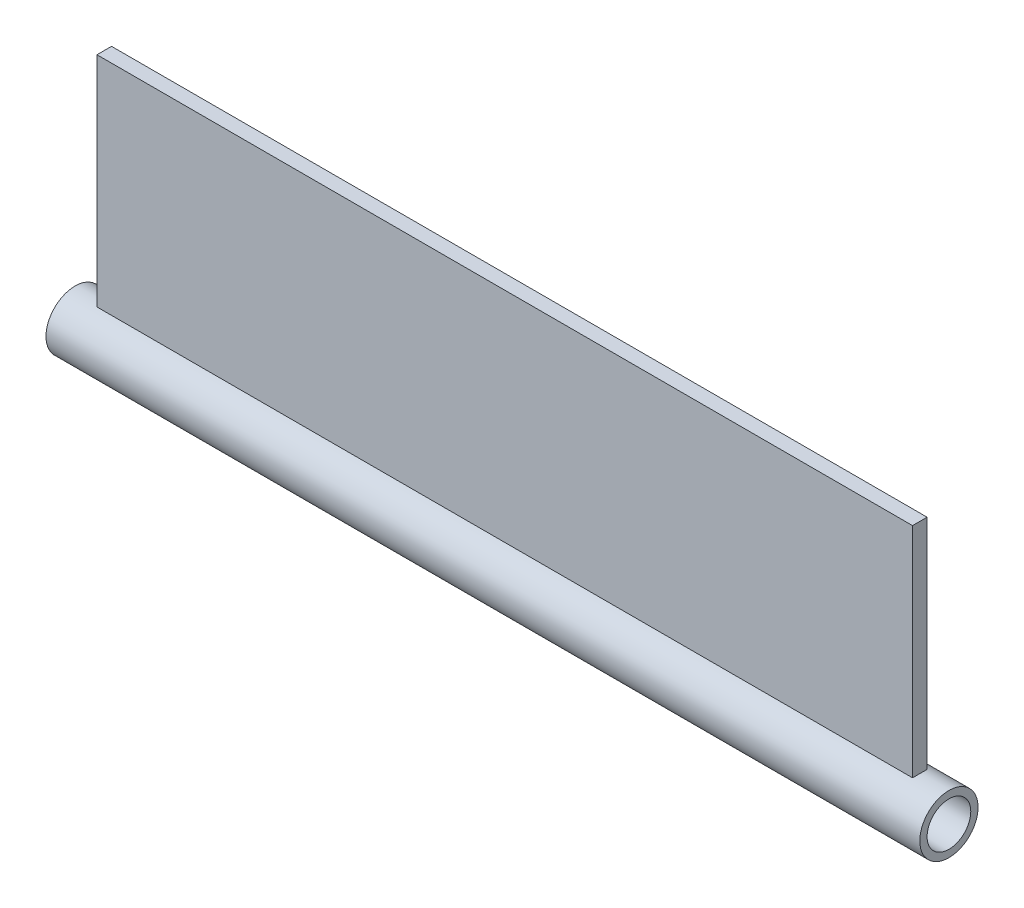
ISO-10303-21;
HEADER;
FILE_DESCRIPTION(('STEP AP214'),'2;1');
FILE_NAME('part.step','',(''),(''),'','','');
FILE_SCHEMA(('AUTOMOTIVE_DESIGN { 1 0 10303 214 1 1 1 1 }'));
ENDSEC;
DATA;
#1=APPLICATION_CONTEXT('core data for automotive mechanical design processes');
#2=APPLICATION_PROTOCOL_DEFINITION('international standard','automotive_design',2000,#1);
#3=PRODUCT_CONTEXT('',#1,'mechanical');
#4=PRODUCT('Part','Part','',(#3));
#5=PRODUCT_RELATED_PRODUCT_CATEGORY('part','',(#4));
#6=PRODUCT_DEFINITION_FORMATION('','',#4);
#7=PRODUCT_DEFINITION_CONTEXT('part definition',#1,'design');
#8=PRODUCT_DEFINITION('design','',#6,#7);
#9=PRODUCT_DEFINITION_SHAPE('','',#8);
#10=(LENGTH_UNIT() NAMED_UNIT(*) SI_UNIT(.MILLI.,.METRE.));
#11=(NAMED_UNIT(*) PLANE_ANGLE_UNIT() SI_UNIT($,.RADIAN.));
#12=(NAMED_UNIT(*) SI_UNIT($,.STERADIAN.) SOLID_ANGLE_UNIT());
#13=UNCERTAINTY_MEASURE_WITH_UNIT(LENGTH_MEASURE(1.E-05),#10,'distance_accuracy_value','');
#14=(GEOMETRIC_REPRESENTATION_CONTEXT(3) GLOBAL_UNCERTAINTY_ASSIGNED_CONTEXT((#13)) GLOBAL_UNIT_ASSIGNED_CONTEXT((#10,
#11,#12)) REPRESENTATION_CONTEXT('',''));
#15=CARTESIAN_POINT('',(0.,0.,0.));
#16=DIRECTION('',(0.,0.,1.));
#17=DIRECTION('',(1.,0.,0.));
#18=AXIS2_PLACEMENT_3D('',#15,#16,#17);
#19=CARTESIAN_POINT('',(147.32,43.18,-1.27));
#20=DIRECTION('',(1.,0.,0.));
#21=DIRECTION('',(0.,0.,-1.));
#22=AXIS2_PLACEMENT_3D('',#19,#20,#21);
#23=PLANE('',#22);
#24=DIRECTION('',(0.,0.,1.));
#25=VECTOR('',#24,1.);
#26=CARTESIAN_POINT('',(147.32,43.18,-1.27));
#27=LINE('',#26,#25);
#28=CARTESIAN_POINT('',(147.32,43.18,-1.27));
#29=VERTEX_POINT('',#28);
#30=CARTESIAN_POINT('',(147.32,43.18,1.27));
#31=VERTEX_POINT('',#30);
#32=EDGE_CURVE('E48',#29,#31,#27,.T.);
#33=ORIENTED_EDGE('',*,*,#32,.T.);
#34=DIRECTION('',(0.,1.,0.));
#35=VECTOR('',#34,1.);
#36=CARTESIAN_POINT('',(147.32,43.18,1.27));
#37=LINE('',#36,#35);
#38=CARTESIAN_POINT('',(147.32,5.08,1.27));
#39=VERTEX_POINT('',#38);
#40=EDGE_CURVE('E85',#39,#31,#37,.T.);
#41=ORIENTED_EDGE('',*,*,#40,.F.);
#42=DIRECTION('',(0.,0.,1.));
#43=VECTOR('',#42,1.);
#44=CARTESIAN_POINT('',(147.32,5.08,-1.27));
#45=LINE('',#44,#43);
#46=CARTESIAN_POINT('',(147.32,5.08,-1.27));
#47=VERTEX_POINT('',#46);
#48=EDGE_CURVE('E12',#47,#39,#45,.T.);
#49=ORIENTED_EDGE('',*,*,#48,.F.);
#50=DIRECTION('',(0.,1.,0.));
#51=VECTOR('',#50,1.);
#52=CARTESIAN_POINT('',(147.32,43.18,-1.27));
#53=LINE('',#52,#51);
#54=EDGE_CURVE('E86',#47,#29,#53,.T.);
#55=ORIENTED_EDGE('',*,*,#54,.T.);
#56=EDGE_LOOP('',(#33,#41,#49,#55));
#57=FACE_BOUND('',#56,.T.);
#58=ADVANCED_FACE('F45',(#57),#23,.T.);
#59=CARTESIAN_POINT('',(147.32,5.08,-1.27));
#60=DIRECTION('',(0.,-1.,0.));
#61=DIRECTION('',(1.,0.,0.));
#62=AXIS2_PLACEMENT_3D('',#59,#60,#61);
#63=PLANE('',#62);
#64=ORIENTED_EDGE('',*,*,#48,.T.);
#65=DIRECTION('',(1.,0.,0.));
#66=VECTOR('',#65,1.);
#67=CARTESIAN_POINT('',(147.32,5.08,1.27));
#68=LINE('',#67,#66);
#69=CARTESIAN_POINT('',(5.08000000000003,5.08,1.27));
#70=VERTEX_POINT('',#69);
#71=EDGE_CURVE('E102',#70,#39,#68,.T.);
#72=ORIENTED_EDGE('',*,*,#71,.F.);
#73=DIRECTION('',(0.,0.,1.));
#74=VECTOR('',#73,1.);
#75=CARTESIAN_POINT('',(5.08000000000003,5.08,-1.27));
#76=LINE('',#75,#74);
#77=CARTESIAN_POINT('',(5.08000000000003,5.08,-1.27));
#78=VERTEX_POINT('',#77);
#79=EDGE_CURVE('E53',#78,#70,#76,.T.);
#80=ORIENTED_EDGE('',*,*,#79,.F.);
#81=DIRECTION('',(1.,0.,0.));
#82=VECTOR('',#81,1.);
#83=CARTESIAN_POINT('',(147.32,5.08,-1.27));
#84=LINE('',#83,#82);
#85=EDGE_CURVE('E91',#78,#47,#84,.T.);
#86=ORIENTED_EDGE('',*,*,#85,.T.);
#87=EDGE_LOOP('',(#64,#72,#80,#86));
#88=FACE_BOUND('',#87,.T.);
#89=ADVANCED_FACE('F117',(#88),#63,.T.);
#90=CARTESIAN_POINT('',(5.08000000000003,43.18,-1.27));
#91=DIRECTION('',(-1.,0.,0.));
#92=DIRECTION('',(0.,0.,1.));
#93=AXIS2_PLACEMENT_3D('',#90,#91,#92);
#94=PLANE('',#93);
#95=ORIENTED_EDGE('',*,*,#79,.T.);
#96=DIRECTION('',(0.,-1.,0.));
#97=VECTOR('',#96,1.);
#98=CARTESIAN_POINT('',(5.08000000000003,43.18,1.27));
#99=LINE('',#98,#97);
#100=CARTESIAN_POINT('',(5.08000000000003,43.18,1.27));
#101=VERTEX_POINT('',#100);
#102=EDGE_CURVE('E98',#101,#70,#99,.T.);
#103=ORIENTED_EDGE('',*,*,#102,.F.);
#104=DIRECTION('',(0.,0.,1.));
#105=VECTOR('',#104,1.);
#106=CARTESIAN_POINT('',(5.08000000000003,43.18,-1.27));
#107=LINE('',#106,#105);
#108=CARTESIAN_POINT('',(5.08000000000003,43.18,-1.27));
#109=VERTEX_POINT('',#108);
#110=EDGE_CURVE('E90',#109,#101,#107,.T.);
#111=ORIENTED_EDGE('',*,*,#110,.F.);
#112=DIRECTION('',(0.,-1.,0.));
#113=VECTOR('',#112,1.);
#114=CARTESIAN_POINT('',(5.08000000000003,43.18,-1.27));
#115=LINE('',#114,#113);
#116=EDGE_CURVE('E110',#109,#78,#115,.T.);
#117=ORIENTED_EDGE('',*,*,#116,.T.);
#118=EDGE_LOOP('',(#95,#103,#111,#117));
#119=FACE_BOUND('',#118,.T.);
#120=ADVANCED_FACE('F114',(#119),#94,.T.);
#121=CARTESIAN_POINT('',(147.32,43.18,-1.27));
#122=DIRECTION('',(0.,1.,0.));
#123=DIRECTION('',(-1.,0.,0.));
#124=AXIS2_PLACEMENT_3D('',#121,#122,#123);
#125=PLANE('',#124);
#126=ORIENTED_EDGE('',*,*,#110,.T.);
#127=DIRECTION('',(-1.,0.,0.));
#128=VECTOR('',#127,1.);
#129=CARTESIAN_POINT('',(147.32,43.18,1.27));
#130=LINE('',#129,#128);
#131=EDGE_CURVE('E93',#31,#101,#130,.T.);
#132=ORIENTED_EDGE('',*,*,#131,.F.);
#133=ORIENTED_EDGE('',*,*,#32,.F.);
#134=DIRECTION('',(-1.,0.,0.));
#135=VECTOR('',#134,1.);
#136=CARTESIAN_POINT('',(147.32,43.18,-1.27));
#137=LINE('',#136,#135);
#138=EDGE_CURVE('E108',#29,#109,#137,.T.);
#139=ORIENTED_EDGE('',*,*,#138,.T.);
#140=EDGE_LOOP('',(#126,#132,#133,#139));
#141=FACE_BOUND('',#140,.T.);
#142=ADVANCED_FACE('F94',(#141),#125,.T.);
#143=CARTESIAN_POINT('',(0.,0.,-1.27));
#144=DIRECTION('',(0.,0.,-1.));
#145=DIRECTION('',(-1.,0.,0.));
#146=AXIS2_PLACEMENT_3D('',#143,#144,#145);
#147=PLANE('',#146);
#148=ORIENTED_EDGE('',*,*,#54,.F.);
#149=ORIENTED_EDGE('',*,*,#85,.F.);
#150=ORIENTED_EDGE('',*,*,#116,.F.);
#151=ORIENTED_EDGE('',*,*,#138,.F.);
#152=EDGE_LOOP('',(#148,#149,#150,#151));
#153=FACE_BOUND('',#152,.T.);
#154=ADVANCED_FACE('F119',(#153),#147,.T.);
#155=CARTESIAN_POINT('',(0.,0.,1.27));
#156=DIRECTION('',(0.,0.,-1.));
#157=DIRECTION('',(-1.,0.,0.));
#158=AXIS2_PLACEMENT_3D('',#155,#156,#157);
#159=PLANE('',#158);
#160=ORIENTED_EDGE('',*,*,#40,.T.);
#161=ORIENTED_EDGE('',*,*,#131,.T.);
#162=ORIENTED_EDGE('',*,*,#102,.T.);
#163=ORIENTED_EDGE('',*,*,#71,.T.);
#164=EDGE_LOOP('',(#160,#161,#162,#163));
#165=FACE_BOUND('',#164,.T.);
#166=ADVANCED_FACE('F101',(#165),#159,.F.);
#167=CLOSED_SHELL('',(#58,#89,#120,#142,#154,#166));
#168=MANIFOLD_SOLID_BREP('B2',#167);
#169=CARTESIAN_POINT('',(152.4,0.,0.));
#170=DIRECTION('',(-1.,0.,0.));
#171=DIRECTION('',(0.,0.,1.));
#172=AXIS2_PLACEMENT_3D('',#169,#170,#171);
#173=CYLINDRICAL_SURFACE('',#172,5.08);
#174=CARTESIAN_POINT('',(152.4,0.,0.));
#175=DIRECTION('',(1.,0.,0.));
#176=DIRECTION('',(0.,0.,-1.));
#177=AXIS2_PLACEMENT_3D('',#174,#175,#176);
#178=CIRCLE('',#177,5.08);
#179=CARTESIAN_POINT('',(152.4,0.,5.08));
#180=VERTEX_POINT('',#179);
#181=EDGE_CURVE('E44',#180,#180,#178,.T.);
#182=CARTESIAN_POINT('',(0.,0.,0.));
#183=DIRECTION('',(1.,0.,0.));
#184=DIRECTION('',(0.,0.,-1.));
#185=AXIS2_PLACEMENT_3D('',#182,#183,#184);
#186=CIRCLE('',#185,5.08);
#187=CARTESIAN_POINT('',(0.,0.,5.08));
#188=VERTEX_POINT('',#187);
#189=EDGE_CURVE('E178',#188,#188,#186,.T.);
#190=CARTESIAN_POINT('',(152.4,0.,5.08));
#191=CARTESIAN_POINT('',(150.8125,0.,5.08));
#192=CARTESIAN_POINT('',(149.225,0.,5.08));
#193=CARTESIAN_POINT('',(146.05,0.,5.08));
#194=CARTESIAN_POINT('',(144.4625,0.,5.08));
#195=CARTESIAN_POINT('',(141.2875,0.,5.08));
#196=CARTESIAN_POINT('',(139.7,0.,5.08));
#197=CARTESIAN_POINT('',(136.525,0.,5.08));
#198=CARTESIAN_POINT('',(134.9375,0.,5.08));
#199=CARTESIAN_POINT('',(131.7625,0.,5.08));
#200=CARTESIAN_POINT('',(130.175,0.,5.08));
#201=CARTESIAN_POINT('',(127.,0.,5.08));
#202=CARTESIAN_POINT('',(125.4125,0.,5.08));
#203=CARTESIAN_POINT('',(122.2375,0.,5.08));
#204=CARTESIAN_POINT('',(120.65,0.,5.08));
#205=CARTESIAN_POINT('',(117.475,0.,5.08));
#206=CARTESIAN_POINT('',(115.8875,0.,5.08));
#207=CARTESIAN_POINT('',(112.7125,0.,5.08));
#208=CARTESIAN_POINT('',(111.125,0.,5.08));
#209=CARTESIAN_POINT('',(107.95,0.,5.08));
#210=CARTESIAN_POINT('',(106.3625,0.,5.08));
#211=CARTESIAN_POINT('',(103.1875,0.,5.08));
#212=CARTESIAN_POINT('',(101.6,0.,5.08));
#213=CARTESIAN_POINT('',(98.425,0.,5.08));
#214=CARTESIAN_POINT('',(96.8375,0.,5.08));
#215=CARTESIAN_POINT('',(93.6625,0.,5.08));
#216=CARTESIAN_POINT('',(92.075,0.,5.08));
#217=CARTESIAN_POINT('',(88.9,0.,5.08));
#218=CARTESIAN_POINT('',(87.3125,0.,5.08));
#219=CARTESIAN_POINT('',(84.1375,0.,5.08));
#220=CARTESIAN_POINT('',(82.55,0.,5.08));
#221=CARTESIAN_POINT('',(79.375,0.,5.08));
#222=CARTESIAN_POINT('',(77.7875,0.,5.08));
#223=CARTESIAN_POINT('',(74.6125,0.,5.08));
#224=CARTESIAN_POINT('',(73.025,0.,5.08));
#225=CARTESIAN_POINT('',(69.85,0.,5.08));
#226=CARTESIAN_POINT('',(68.2625,0.,5.08));
#227=CARTESIAN_POINT('',(65.0875,0.,5.08));
#228=CARTESIAN_POINT('',(63.5,0.,5.08));
#229=CARTESIAN_POINT('',(60.325,0.,5.08));
#230=CARTESIAN_POINT('',(58.7375,0.,5.08));
#231=CARTESIAN_POINT('',(55.5625,0.,5.08));
#232=CARTESIAN_POINT('',(53.975,0.,5.08));
#233=CARTESIAN_POINT('',(50.8,0.,5.08));
#234=CARTESIAN_POINT('',(49.2125,0.,5.08));
#235=CARTESIAN_POINT('',(46.0375,0.,5.08));
#236=CARTESIAN_POINT('',(44.45,0.,5.08));
#237=CARTESIAN_POINT('',(41.275,0.,5.08));
#238=CARTESIAN_POINT('',(39.6875,0.,5.08));
#239=CARTESIAN_POINT('',(36.5125,0.,5.08));
#240=CARTESIAN_POINT('',(34.925,0.,5.08));
#241=CARTESIAN_POINT('',(31.75,0.,5.08));
#242=CARTESIAN_POINT('',(30.1625,0.,5.08));
#243=CARTESIAN_POINT('',(26.9875,0.,5.08));
#244=CARTESIAN_POINT('',(25.4,0.,5.08));
#245=CARTESIAN_POINT('',(22.225,0.,5.08));
#246=CARTESIAN_POINT('',(20.6375,0.,5.08));
#247=CARTESIAN_POINT('',(17.4625,0.,5.08));
#248=CARTESIAN_POINT('',(15.875,0.,5.08));
#249=CARTESIAN_POINT('',(12.7,0.,5.08));
#250=CARTESIAN_POINT('',(11.1125,0.,5.08));
#251=CARTESIAN_POINT('',(7.93750000000001,0.,5.08));
#252=CARTESIAN_POINT('',(6.35,0.,5.08));
#253=CARTESIAN_POINT('',(3.175,0.,5.08));
#254=CARTESIAN_POINT('',(1.5875,0.,5.08));
#255=CARTESIAN_POINT('',(0.,0.,5.08));
#256=B_SPLINE_CURVE_WITH_KNOTS('',3,(#190,#191,#192,#193,#194,#195,#196,#197,#198,#199,#200,
#201,#202,#203,#204,#205,#206,#207,#208,#209,#210,#211,#212,#213,#214,#215,#216,#217,#218,#219,
#220,#221,#222,#223,#224,#225,#226,#227,#228,#229,#230,#231,#232,#233,#234,#235,#236,#237,#238,
#239,#240,#241,#242,#243,#244,#245,#246,#247,#248,#249,#250,#251,#252,#253,#254,#255),
.UNSPECIFIED.,.F.,.F.,(4,2,2,2,2,2,2,2,2,2,2,2,2,2,2,2,2,2,2,2,2,2,2,2,2,2,2,2,2,2,2,2,4),(0.,
4.76249999999998,9.52499999999998,14.2875,19.05,23.8125,28.575,33.3375,38.1,42.8625,47.625,
52.3875,57.15,61.9125,66.675,71.4375,76.2,80.9625,85.725,90.4875,95.25,100.0125,104.775,
109.5375,114.3,119.0625,123.825,128.5875,133.35,138.1125,142.875,147.6375,152.4),.UNSPECIFIED.);
#257=EDGE_CURVE('BSEAM175',#180,#188,#256,.T.);
#258=ORIENTED_EDGE('',*,*,#181,.F.);
#259=ORIENTED_EDGE('',*,*,#189,.T.);
#260=ORIENTED_EDGE('',*,*,#257,.T.);
#261=ORIENTED_EDGE('',*,*,#257,.F.);
#262=EDGE_LOOP('',(#258,#260,#259,#261));
#263=FACE_BOUND('',#262,.T.);
#264=ADVANCED_FACE('F175',(#263),#173,.T.);
#265=CARTESIAN_POINT('',(152.4,0.,0.));
#266=DIRECTION('',(1.,0.,0.));
#267=DIRECTION('',(0.,0.,-1.));
#268=AXIS2_PLACEMENT_3D('',#265,#266,#267);
#269=PLANE('',#268);
#270=CARTESIAN_POINT('',(152.4,0.,0.));
#271=DIRECTION('',(1.,0.,0.));
#272=DIRECTION('',(0.,0.,-1.));
#273=AXIS2_PLACEMENT_3D('',#270,#271,#272);
#274=CIRCLE('',#273,3.81);
#275=CARTESIAN_POINT('',(152.4,0.,-3.81));
#276=VERTEX_POINT('',#275);
#277=EDGE_CURVE('E187',#276,#276,#274,.T.);
#278=ORIENTED_EDGE('',*,*,#277,.F.);
#279=EDGE_LOOP('',(#278));
#280=FACE_BOUND('',#279,.T.);
#281=ORIENTED_EDGE('',*,*,#181,.T.);
#282=EDGE_LOOP('',(#281));
#283=FACE_BOUND('',#282,.T.);
#284=ADVANCED_FACE('F202',(#280,#283),#269,.T.);
#285=CARTESIAN_POINT('',(0.,0.,0.));
#286=DIRECTION('',(1.,0.,0.));
#287=DIRECTION('',(0.,0.,-1.));
#288=AXIS2_PLACEMENT_3D('',#285,#286,#287);
#289=PLANE('',#288);
#290=CARTESIAN_POINT('',(0.,0.,0.));
#291=DIRECTION('',(1.,0.,0.));
#292=DIRECTION('',(0.,0.,-1.));
#293=AXIS2_PLACEMENT_3D('',#290,#291,#292);
#294=CIRCLE('',#293,3.81);
#295=CARTESIAN_POINT('',(0.,0.,-3.81));
#296=VERTEX_POINT('',#295);
#297=EDGE_CURVE('E185',#296,#296,#294,.T.);
#298=ORIENTED_EDGE('',*,*,#297,.T.);
#299=EDGE_LOOP('',(#298));
#300=FACE_BOUND('',#299,.T.);
#301=ORIENTED_EDGE('',*,*,#189,.F.);
#302=EDGE_LOOP('',(#301));
#303=FACE_BOUND('',#302,.T.);
#304=ADVANCED_FACE('F193',(#300,#303),#289,.F.);
#305=CARTESIAN_POINT('',(0.,0.,0.));
#306=DIRECTION('',(1.,0.,0.));
#307=DIRECTION('',(0.,0.,-1.));
#308=AXIS2_PLACEMENT_3D('',#305,#306,#307);
#309=CYLINDRICAL_SURFACE('',#308,3.81);
#310=CARTESIAN_POINT('',(0.,0.,-3.81));
#311=CARTESIAN_POINT('',(1.5875,0.,-3.81));
#312=CARTESIAN_POINT('',(3.175,0.,-3.81));
#313=CARTESIAN_POINT('',(6.35,0.,-3.81));
#314=CARTESIAN_POINT('',(7.9375,0.,-3.81));
#315=CARTESIAN_POINT('',(11.1125,0.,-3.81));
#316=CARTESIAN_POINT('',(12.7,0.,-3.81));
#317=CARTESIAN_POINT('',(15.875,0.,-3.81));
#318=CARTESIAN_POINT('',(17.4625,0.,-3.81));
#319=CARTESIAN_POINT('',(20.6375,0.,-3.81));
#320=CARTESIAN_POINT('',(22.225,0.,-3.81));
#321=CARTESIAN_POINT('',(25.4,0.,-3.81));
#322=CARTESIAN_POINT('',(26.9875,0.,-3.81));
#323=CARTESIAN_POINT('',(30.1625,0.,-3.81));
#324=CARTESIAN_POINT('',(31.75,0.,-3.81));
#325=CARTESIAN_POINT('',(34.925,0.,-3.81));
#326=CARTESIAN_POINT('',(36.5125,0.,-3.81));
#327=CARTESIAN_POINT('',(39.6875,0.,-3.81));
#328=CARTESIAN_POINT('',(41.275,0.,-3.81));
#329=CARTESIAN_POINT('',(44.45,0.,-3.81));
#330=CARTESIAN_POINT('',(46.0375,0.,-3.81));
#331=CARTESIAN_POINT('',(49.2125,0.,-3.81));
#332=CARTESIAN_POINT('',(50.8,0.,-3.81));
#333=CARTESIAN_POINT('',(53.975,0.,-3.81));
#334=CARTESIAN_POINT('',(55.5625,0.,-3.81));
#335=CARTESIAN_POINT('',(58.7375,0.,-3.81));
#336=CARTESIAN_POINT('',(60.325,0.,-3.81));
#337=CARTESIAN_POINT('',(63.5,0.,-3.81));
#338=CARTESIAN_POINT('',(65.0875,0.,-3.81));
#339=CARTESIAN_POINT('',(68.2625,0.,-3.81));
#340=CARTESIAN_POINT('',(69.85,0.,-3.81));
#341=CARTESIAN_POINT('',(73.025,0.,-3.81));
#342=CARTESIAN_POINT('',(74.6125,0.,-3.81));
#343=CARTESIAN_POINT('',(77.7875,0.,-3.81));
#344=CARTESIAN_POINT('',(79.375,0.,-3.81));
#345=CARTESIAN_POINT('',(82.55,0.,-3.81));
#346=CARTESIAN_POINT('',(84.1375,0.,-3.81));
#347=CARTESIAN_POINT('',(87.3125,0.,-3.81));
#348=CARTESIAN_POINT('',(88.9,0.,-3.81));
#349=CARTESIAN_POINT('',(92.075,0.,-3.81));
#350=CARTESIAN_POINT('',(93.6625,0.,-3.81));
#351=CARTESIAN_POINT('',(96.8375,0.,-3.81));
#352=CARTESIAN_POINT('',(98.425,0.,-3.81));
#353=CARTESIAN_POINT('',(101.6,0.,-3.81));
#354=CARTESIAN_POINT('',(103.1875,0.,-3.81));
#355=CARTESIAN_POINT('',(106.3625,0.,-3.81));
#356=CARTESIAN_POINT('',(107.95,0.,-3.81));
#357=CARTESIAN_POINT('',(111.125,0.,-3.81));
#358=CARTESIAN_POINT('',(112.7125,0.,-3.81));
#359=CARTESIAN_POINT('',(115.8875,0.,-3.81));
#360=CARTESIAN_POINT('',(117.475,0.,-3.81));
#361=CARTESIAN_POINT('',(120.65,0.,-3.81));
#362=CARTESIAN_POINT('',(122.2375,0.,-3.81));
#363=CARTESIAN_POINT('',(125.4125,0.,-3.81));
#364=CARTESIAN_POINT('',(127.,0.,-3.81));
#365=CARTESIAN_POINT('',(130.175,0.,-3.81));
#366=CARTESIAN_POINT('',(131.7625,0.,-3.81));
#367=CARTESIAN_POINT('',(134.9375,0.,-3.81));
#368=CARTESIAN_POINT('',(136.525,0.,-3.81));
#369=CARTESIAN_POINT('',(139.7,0.,-3.81));
#370=CARTESIAN_POINT('',(141.2875,0.,-3.81));
#371=CARTESIAN_POINT('',(144.4625,0.,-3.81));
#372=CARTESIAN_POINT('',(146.05,0.,-3.81));
#373=CARTESIAN_POINT('',(149.225,0.,-3.81));
#374=CARTESIAN_POINT('',(150.8125,0.,-3.81));
#375=CARTESIAN_POINT('',(152.4,0.,-3.81));
#376=B_SPLINE_CURVE_WITH_KNOTS('',3,(#310,#311,#312,#313,#314,#315,#316,#317,#318,#319,#320,
#321,#322,#323,#324,#325,#326,#327,#328,#329,#330,#331,#332,#333,#334,#335,#336,#337,#338,#339,
#340,#341,#342,#343,#344,#345,#346,#347,#348,#349,#350,#351,#352,#353,#354,#355,#356,#357,#358,
#359,#360,#361,#362,#363,#364,#365,#366,#367,#368,#369,#370,#371,#372,#373,#374,#375),
.UNSPECIFIED.,.F.,.F.,(4,2,2,2,2,2,2,2,2,2,2,2,2,2,2,2,2,2,2,2,2,2,2,2,2,2,2,2,2,2,2,2,4),(0.,
4.7625,9.525,14.2875,19.05,23.8125,28.575,33.3375,38.1,42.8625,47.625,52.3875,57.15,61.9125,
66.675,71.4375,76.2,80.9625,85.725,90.4875,95.25,100.0125,104.775,109.5375,114.3,119.0625,
123.825,128.5875,133.35,138.1125,142.875,147.6375,152.4),.UNSPECIFIED.);
#377=EDGE_CURVE('BSEAM196',#296,#276,#376,.T.);
#378=ORIENTED_EDGE('',*,*,#297,.F.);
#379=ORIENTED_EDGE('',*,*,#277,.T.);
#380=ORIENTED_EDGE('',*,*,#377,.T.);
#381=ORIENTED_EDGE('',*,*,#377,.F.);
#382=EDGE_LOOP('',(#378,#380,#379,#381));
#383=FACE_BOUND('',#382,.T.);
#384=ADVANCED_FACE('F196',(#383),#309,.F.);
#385=CLOSED_SHELL('',(#264,#284,#304,#384));
#386=MANIFOLD_SOLID_BREP('B6',#385);
#387=ADVANCED_BREP_SHAPE_REPRESENTATION('',(#18,#168,#386),#14);
#388=SHAPE_DEFINITION_REPRESENTATION(#9,#387);
ENDSEC;
END-ISO-10303-21;
